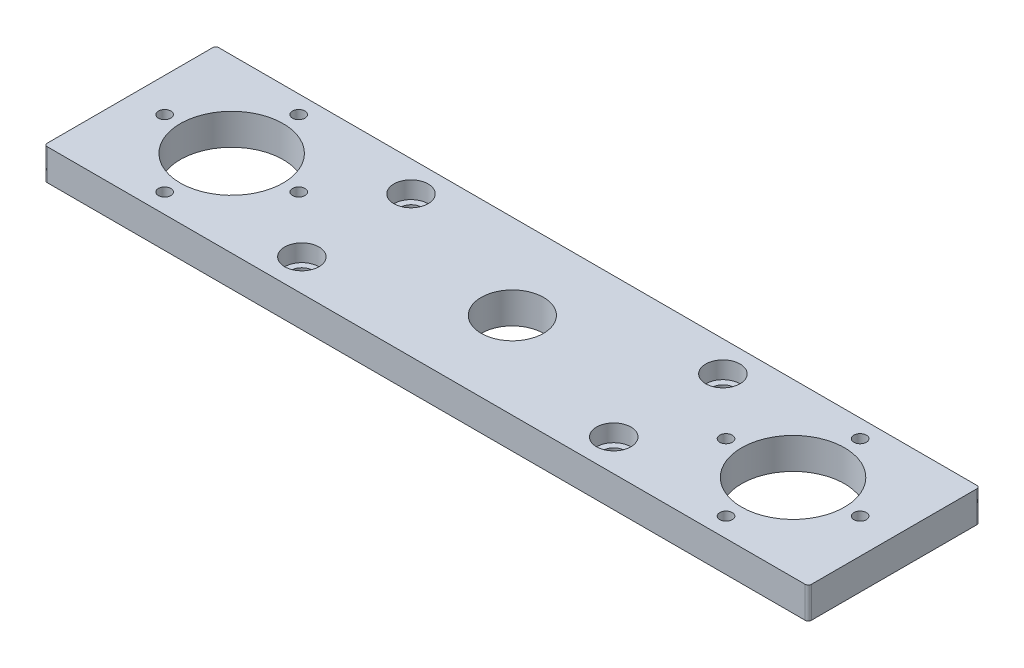
ISO-10303-21;
HEADER;
FILE_DESCRIPTION(('STEP AP214'),'2;1');
FILE_NAME('part.step','',(''),(''),'','','');
FILE_SCHEMA(('AUTOMOTIVE_DESIGN { 1 0 10303 214 1 1 1 1 }'));
ENDSEC;
DATA;
#1=APPLICATION_CONTEXT('core data for automotive mechanical design processes');
#2=APPLICATION_PROTOCOL_DEFINITION('international standard','automotive_design',2000,#1);
#3=PRODUCT_CONTEXT('',#1,'mechanical');
#4=PRODUCT('Part','Part','',(#3));
#5=PRODUCT_RELATED_PRODUCT_CATEGORY('part','',(#4));
#6=PRODUCT_DEFINITION_FORMATION('','',#4);
#7=PRODUCT_DEFINITION_CONTEXT('part definition',#1,'design');
#8=PRODUCT_DEFINITION('design','',#6,#7);
#9=PRODUCT_DEFINITION_SHAPE('','',#8);
#10=(LENGTH_UNIT() NAMED_UNIT(*) SI_UNIT(.MILLI.,.METRE.));
#11=(NAMED_UNIT(*) PLANE_ANGLE_UNIT() SI_UNIT($,.RADIAN.));
#12=(NAMED_UNIT(*) SI_UNIT($,.STERADIAN.) SOLID_ANGLE_UNIT());
#13=UNCERTAINTY_MEASURE_WITH_UNIT(LENGTH_MEASURE(1.E-05),#10,'distance_accuracy_value','');
#14=(GEOMETRIC_REPRESENTATION_CONTEXT(3) GLOBAL_UNCERTAINTY_ASSIGNED_CONTEXT((#13)) GLOBAL_UNIT_ASSIGNED_CONTEXT((#10,
#11,#12)) REPRESENTATION_CONTEXT('',''));
#15=CARTESIAN_POINT('',(0.,0.,0.));
#16=DIRECTION('',(0.,0.,1.));
#17=DIRECTION('',(1.,0.,0.));
#18=AXIS2_PLACEMENT_3D('',#15,#16,#17);
#19=CARTESIAN_POINT('',(72.5,10.,-45.));
#20=DIRECTION('',(0.,-1.,0.));
#21=DIRECTION('',(0.,0.,-1.));
#22=AXIS2_PLACEMENT_3D('',#19,#20,#21);
#23=CYLINDRICAL_SURFACE('',#22,3.50000000000001);
#24=CARTESIAN_POINT('',(72.5,0.,-45.));
#25=DIRECTION('',(0.,1.,0.));
#26=DIRECTION('',(0.,0.,1.));
#27=AXIS2_PLACEMENT_3D('',#24,#25,#26);
#28=CIRCLE('',#27,3.50000000000001);
#29=CARTESIAN_POINT('',(72.5,0.,-41.5));
#30=VERTEX_POINT('',#29);
#31=EDGE_CURVE('E605',#30,#30,#28,.F.);
#32=ORIENTED_EDGE('',*,*,#31,.T.);
#33=EDGE_LOOP('',(#32));
#34=FACE_BOUND('',#33,.T.);
#35=CARTESIAN_POINT('',(72.5,4.5,-45.));
#36=DIRECTION('',(0.,1.,0.));
#37=DIRECTION('',(0.,0.,1.));
#38=AXIS2_PLACEMENT_3D('',#35,#36,#37);
#39=CIRCLE('',#38,3.50000000000001);
#40=CARTESIAN_POINT('',(72.5,4.5,-41.5));
#41=VERTEX_POINT('',#40);
#42=EDGE_CURVE('E520',#41,#41,#39,.F.);
#43=ORIENTED_EDGE('',*,*,#42,.F.);
#44=EDGE_LOOP('',(#43));
#45=FACE_BOUND('',#44,.T.);
#46=ADVANCED_FACE('F394',(#34,#45),#23,.F.);
#47=CARTESIAN_POINT('',(72.5,10.,-10.));
#48=DIRECTION('',(0.,-1.,0.));
#49=DIRECTION('',(0.,0.,-1.));
#50=AXIS2_PLACEMENT_3D('',#47,#48,#49);
#51=CYLINDRICAL_SURFACE('',#50,3.50000000000001);
#52=CARTESIAN_POINT('',(72.5,0.,-10.));
#53=DIRECTION('',(0.,1.,0.));
#54=DIRECTION('',(0.,0.,1.));
#55=AXIS2_PLACEMENT_3D('',#52,#53,#54);
#56=CIRCLE('',#55,3.50000000000001);
#57=CARTESIAN_POINT('',(72.5,0.,-6.49999999999999));
#58=VERTEX_POINT('',#57);
#59=EDGE_CURVE('E612',#58,#58,#56,.T.);
#60=ORIENTED_EDGE('',*,*,#59,.F.);
#61=EDGE_LOOP('',(#60));
#62=FACE_BOUND('',#61,.T.);
#63=CARTESIAN_POINT('',(72.5,4.5,-10.));
#64=DIRECTION('',(0.,1.,0.));
#65=DIRECTION('',(0.,0.,1.));
#66=AXIS2_PLACEMENT_3D('',#63,#64,#65);
#67=CIRCLE('',#66,3.50000000000001);
#68=CARTESIAN_POINT('',(72.5,4.5,-6.49999999999999));
#69=VERTEX_POINT('',#68);
#70=EDGE_CURVE('E516',#69,#69,#67,.T.);
#71=ORIENTED_EDGE('',*,*,#70,.T.);
#72=EDGE_LOOP('',(#71));
#73=FACE_BOUND('',#72,.T.);
#74=ADVANCED_FACE('F782',(#62,#73),#51,.F.);
#75=CARTESIAN_POINT('',(172.5,10.,-45.));
#76=DIRECTION('',(0.,-1.,0.));
#77=DIRECTION('',(0.,0.,-1.));
#78=AXIS2_PLACEMENT_3D('',#75,#76,#77);
#79=CYLINDRICAL_SURFACE('',#78,3.49999999999999);
#80=CARTESIAN_POINT('',(172.5,0.,-45.));
#81=DIRECTION('',(0.,1.,0.));
#82=DIRECTION('',(0.,0.,1.));
#83=AXIS2_PLACEMENT_3D('',#80,#81,#82);
#84=CIRCLE('',#83,3.49999999999999);
#85=CARTESIAN_POINT('',(172.5,0.,-41.5));
#86=VERTEX_POINT('',#85);
#87=EDGE_CURVE('E616',#86,#86,#84,.T.);
#88=ORIENTED_EDGE('',*,*,#87,.F.);
#89=EDGE_LOOP('',(#88));
#90=FACE_BOUND('',#89,.T.);
#91=CARTESIAN_POINT('',(172.5,4.5,-45.));
#92=DIRECTION('',(0.,1.,0.));
#93=DIRECTION('',(0.,0.,1.));
#94=AXIS2_PLACEMENT_3D('',#91,#92,#93);
#95=CIRCLE('',#94,3.49999999999999);
#96=CARTESIAN_POINT('',(172.5,4.5,-41.5));
#97=VERTEX_POINT('',#96);
#98=EDGE_CURVE('E511',#97,#97,#95,.T.);
#99=ORIENTED_EDGE('',*,*,#98,.T.);
#100=EDGE_LOOP('',(#99));
#101=FACE_BOUND('',#100,.T.);
#102=ADVANCED_FACE('F788',(#90,#101),#79,.F.);
#103=CARTESIAN_POINT('',(172.5,10.,-10.));
#104=DIRECTION('',(0.,-1.,0.));
#105=DIRECTION('',(0.,0.,-1.));
#106=AXIS2_PLACEMENT_3D('',#103,#104,#105);
#107=CYLINDRICAL_SURFACE('',#106,3.49999999999999);
#108=CARTESIAN_POINT('',(172.5,0.,-10.));
#109=DIRECTION('',(0.,1.,0.));
#110=DIRECTION('',(0.,0.,1.));
#111=AXIS2_PLACEMENT_3D('',#108,#109,#110);
#112=CIRCLE('',#111,3.49999999999999);
#113=CARTESIAN_POINT('',(172.5,0.,-6.50000000000001));
#114=VERTEX_POINT('',#113);
#115=EDGE_CURVE('E620',#114,#114,#112,.F.);
#116=ORIENTED_EDGE('',*,*,#115,.T.);
#117=EDGE_LOOP('',(#116));
#118=FACE_BOUND('',#117,.T.);
#119=CARTESIAN_POINT('',(172.5,4.5,-10.));
#120=DIRECTION('',(0.,1.,0.));
#121=DIRECTION('',(0.,0.,1.));
#122=AXIS2_PLACEMENT_3D('',#119,#120,#121);
#123=CIRCLE('',#122,3.49999999999999);
#124=CARTESIAN_POINT('',(172.5,4.5,-6.50000000000001));
#125=VERTEX_POINT('',#124);
#126=EDGE_CURVE('E507',#125,#125,#123,.F.);
#127=ORIENTED_EDGE('',*,*,#126,.F.);
#128=EDGE_LOOP('',(#127));
#129=FACE_BOUND('',#128,.T.);
#130=ADVANCED_FACE('F733',(#118,#129),#107,.F.);
#131=CARTESIAN_POINT('',(0.,10.,0.));
#132=DIRECTION('',(0.,1.,0.));
#133=DIRECTION('',(0.,0.,1.));
#134=AXIS2_PLACEMENT_3D('',#131,#132,#133);
#135=PLANE('',#134);
#136=CARTESIAN_POINT('',(72.5,10.,-10.));
#137=DIRECTION('',(0.,1.,0.));
#138=DIRECTION('',(0.,0.,1.));
#139=AXIS2_PLACEMENT_3D('',#136,#137,#138);
#140=CIRCLE('',#139,5.5);
#141=CARTESIAN_POINT('',(72.5,10.,-4.5));
#142=VERTEX_POINT('',#141);
#143=EDGE_CURVE('E699',#142,#142,#140,.T.);
#144=ORIENTED_EDGE('',*,*,#143,.F.);
#145=EDGE_LOOP('',(#144));
#146=FACE_BOUND('',#145,.T.);
#147=CARTESIAN_POINT('',(172.5,10.,-45.));
#148=DIRECTION('',(0.,1.,0.));
#149=DIRECTION('',(0.,0.,1.));
#150=AXIS2_PLACEMENT_3D('',#147,#148,#149);
#151=CIRCLE('',#150,5.50000000000002);
#152=CARTESIAN_POINT('',(172.5,10.,-39.5));
#153=VERTEX_POINT('',#152);
#154=EDGE_CURVE('E707',#153,#153,#151,.T.);
#155=ORIENTED_EDGE('',*,*,#154,.F.);
#156=EDGE_LOOP('',(#155));
#157=FACE_BOUND('',#156,.T.);
#158=CARTESIAN_POINT('',(172.5,10.,-10.));
#159=DIRECTION('',(0.,1.,0.));
#160=DIRECTION('',(0.,0.,1.));
#161=AXIS2_PLACEMENT_3D('',#158,#159,#160);
#162=CIRCLE('',#161,5.50000000000002);
#163=CARTESIAN_POINT('',(172.5,10.,-4.49999999999998));
#164=VERTEX_POINT('',#163);
#165=EDGE_CURVE('E708',#164,#164,#162,.T.);
#166=ORIENTED_EDGE('',*,*,#165,.F.);
#167=EDGE_LOOP('',(#166));
#168=FACE_BOUND('',#167,.T.);
#169=CARTESIAN_POINT('',(72.5,10.,-45.));
#170=DIRECTION('',(0.,1.,0.));
#171=DIRECTION('',(0.,0.,1.));
#172=AXIS2_PLACEMENT_3D('',#169,#170,#171);
#173=CIRCLE('',#172,5.5);
#174=CARTESIAN_POINT('',(72.5,10.,-39.5));
#175=VERTEX_POINT('',#174);
#176=EDGE_CURVE('E695',#175,#175,#173,.T.);
#177=ORIENTED_EDGE('',*,*,#176,.F.);
#178=EDGE_LOOP('',(#177));
#179=FACE_BOUND('',#178,.T.);
#180=CARTESIAN_POINT('',(212.5,10.,-49.));
#181=DIRECTION('',(0.,1.,0.));
#182=DIRECTION('',(0.,0.,1.));
#183=AXIS2_PLACEMENT_3D('',#180,#181,#182);
#184=CIRCLE('',#183,2.);
#185=CARTESIAN_POINT('',(212.5,10.,-47.));
#186=VERTEX_POINT('',#185);
#187=EDGE_CURVE('E653',#186,#186,#184,.T.);
#188=ORIENTED_EDGE('',*,*,#187,.F.);
#189=EDGE_LOOP('',(#188));
#190=FACE_BOUND('',#189,.T.);
#191=CARTESIAN_POINT('',(32.5,10.,-6.));
#192=DIRECTION('',(0.,1.,0.));
#193=DIRECTION('',(0.,0.,1.));
#194=AXIS2_PLACEMENT_3D('',#191,#192,#193);
#195=CIRCLE('',#194,2.);
#196=CARTESIAN_POINT('',(32.5,10.,-4.));
#197=VERTEX_POINT('',#196);
#198=EDGE_CURVE('E637',#197,#197,#195,.T.);
#199=ORIENTED_EDGE('',*,*,#198,.F.);
#200=EDGE_LOOP('',(#199));
#201=FACE_BOUND('',#200,.T.);
#202=CARTESIAN_POINT('',(122.5,10.,-27.5));
#203=DIRECTION('',(0.,1.,0.));
#204=DIRECTION('',(0.,0.,1.));
#205=AXIS2_PLACEMENT_3D('',#202,#203,#204);
#206=CIRCLE('',#205,10.);
#207=CARTESIAN_POINT('',(122.5,10.,-17.5));
#208=VERTEX_POINT('',#207);
#209=EDGE_CURVE('E597',#208,#208,#206,.T.);
#210=ORIENTED_EDGE('',*,*,#209,.F.);
#211=EDGE_LOOP('',(#210));
#212=FACE_BOUND('',#211,.T.);
#213=CARTESIAN_POINT('',(212.5,10.,-27.5));
#214=DIRECTION('',(0.,1.,0.));
#215=DIRECTION('',(0.,0.,1.));
#216=AXIS2_PLACEMENT_3D('',#213,#214,#215);
#217=CIRCLE('',#216,16.5);
#218=CARTESIAN_POINT('',(212.5,10.,-11.));
#219=VERTEX_POINT('',#218);
#220=EDGE_CURVE('E499',#219,#219,#217,.F.);
#221=ORIENTED_EDGE('',*,*,#220,.T.);
#222=EDGE_LOOP('',(#221));
#223=FACE_BOUND('',#222,.T.);
#224=DIRECTION('',(1.,0.,0.));
#225=VECTOR('',#224,1.);
#226=CARTESIAN_POINT('',(0.117986059408021,10.,0.235972118816041));
#227=LINE('',#226,#225);
#228=CARTESIAN_POINT('',(1.11798605940802,10.,0.235972118816041));
#229=VERTEX_POINT('',#228);
#230=CARTESIAN_POINT('',(244.117986059408,10.,0.235972118816041));
#231=VERTEX_POINT('',#230);
#232=EDGE_CURVE('E577',#229,#231,#227,.T.);
#233=ORIENTED_EDGE('',*,*,#232,.T.);
#234=CARTESIAN_POINT('',(244.117986059408,10.,-0.764027881183959));
#235=DIRECTION('',(0.,1.,0.));
#236=DIRECTION('',(0.,0.,1.));
#237=AXIS2_PLACEMENT_3D('',#234,#235,#236);
#238=CIRCLE('',#237,1.);
#239=CARTESIAN_POINT('',(245.117986059408,10.,-0.764027881183959));
#240=VERTEX_POINT('',#239);
#241=EDGE_CURVE('E548',#231,#240,#238,.T.);
#242=ORIENTED_EDGE('',*,*,#241,.T.);
#243=DIRECTION('',(0.,0.,-1.));
#244=VECTOR('',#243,1.);
#245=CARTESIAN_POINT('',(245.117986059408,10.,0.235972118816041));
#246=LINE('',#245,#244);
#247=CARTESIAN_POINT('',(245.117986059408,10.,-53.764027881184));
#248=VERTEX_POINT('',#247);
#249=EDGE_CURVE('E482',#240,#248,#246,.T.);
#250=ORIENTED_EDGE('',*,*,#249,.T.);
#251=CARTESIAN_POINT('',(244.117986059408,10.,-53.764027881184));
#252=DIRECTION('',(0.,1.,0.));
#253=DIRECTION('',(0.,0.,1.));
#254=AXIS2_PLACEMENT_3D('',#251,#252,#253);
#255=CIRCLE('',#254,1.);
#256=CARTESIAN_POINT('',(244.117986059408,10.,-54.764027881184));
#257=VERTEX_POINT('',#256);
#258=EDGE_CURVE('E545',#248,#257,#255,.T.);
#259=ORIENTED_EDGE('',*,*,#258,.T.);
#260=DIRECTION('',(1.,0.,0.));
#261=VECTOR('',#260,1.);
#262=CARTESIAN_POINT('',(0.117986059408021,10.,-54.764027881184));
#263=LINE('',#262,#261);
#264=CARTESIAN_POINT('',(1.11798605940802,10.,-54.764027881184));
#265=VERTEX_POINT('',#264);
#266=EDGE_CURVE('E506',#265,#257,#263,.T.);
#267=ORIENTED_EDGE('',*,*,#266,.F.);
#268=CARTESIAN_POINT('',(1.11798605940802,10.,-53.764027881184));
#269=DIRECTION('',(0.,1.,0.));
#270=DIRECTION('',(0.,0.,1.));
#271=AXIS2_PLACEMENT_3D('',#268,#269,#270);
#272=CIRCLE('',#271,1.);
#273=CARTESIAN_POINT('',(0.117986059408021,10.,-53.764027881184));
#274=VERTEX_POINT('',#273);
#275=EDGE_CURVE('E410',#265,#274,#272,.T.);
#276=ORIENTED_EDGE('',*,*,#275,.T.);
#277=DIRECTION('',(0.,0.,-1.));
#278=VECTOR('',#277,1.);
#279=CARTESIAN_POINT('',(0.117986059408021,10.,0.235972118816041));
#280=LINE('',#279,#278);
#281=CARTESIAN_POINT('',(0.117986059408021,10.,-0.764027881183959));
#282=VERTEX_POINT('',#281);
#283=EDGE_CURVE('E526',#282,#274,#280,.T.);
#284=ORIENTED_EDGE('',*,*,#283,.F.);
#285=CARTESIAN_POINT('',(1.11798605940802,10.,-0.764027881183959));
#286=DIRECTION('',(0.,1.,0.));
#287=DIRECTION('',(0.,0.,1.));
#288=AXIS2_PLACEMENT_3D('',#285,#286,#287);
#289=CIRCLE('',#288,1.);
#290=EDGE_CURVE('E540',#282,#229,#289,.T.);
#291=ORIENTED_EDGE('',*,*,#290,.T.);
#292=EDGE_LOOP('',(#233,#242,#250,#259,#267,#276,#284,#291));
#293=FACE_BOUND('',#292,.T.);
#294=CARTESIAN_POINT('',(32.5,10.,-49.));
#295=DIRECTION('',(0.,1.,0.));
#296=DIRECTION('',(0.,0.,1.));
#297=AXIS2_PLACEMENT_3D('',#294,#295,#296);
#298=CIRCLE('',#297,2.00000000000001);
#299=CARTESIAN_POINT('',(32.5,10.,-47.));
#300=VERTEX_POINT('',#299);
#301=EDGE_CURVE('E624',#300,#300,#298,.F.);
#302=ORIENTED_EDGE('',*,*,#301,.T.);
#303=EDGE_LOOP('',(#302));
#304=FACE_BOUND('',#303,.T.);
#305=CARTESIAN_POINT('',(54.,10.,-27.5));
#306=DIRECTION('',(0.,1.,0.));
#307=DIRECTION('',(0.,0.,1.));
#308=AXIS2_PLACEMENT_3D('',#305,#306,#307);
#309=CIRCLE('',#308,2.);
#310=CARTESIAN_POINT('',(54.,10.,-25.5));
#311=VERTEX_POINT('',#310);
#312=EDGE_CURVE('E629',#311,#311,#309,.T.);
#313=ORIENTED_EDGE('',*,*,#312,.F.);
#314=EDGE_LOOP('',(#313));
#315=FACE_BOUND('',#314,.T.);
#316=CARTESIAN_POINT('',(11.,10.,-27.5));
#317=DIRECTION('',(0.,1.,0.));
#318=DIRECTION('',(0.,0.,1.));
#319=AXIS2_PLACEMENT_3D('',#316,#317,#318);
#320=CIRCLE('',#319,2.);
#321=CARTESIAN_POINT('',(11.,10.,-25.5));
#322=VERTEX_POINT('',#321);
#323=EDGE_CURVE('E645',#322,#322,#320,.T.);
#324=ORIENTED_EDGE('',*,*,#323,.F.);
#325=EDGE_LOOP('',(#324));
#326=FACE_BOUND('',#325,.T.);
#327=CARTESIAN_POINT('',(191.,10.,-27.5));
#328=DIRECTION('',(0.,1.,0.));
#329=DIRECTION('',(0.,0.,1.));
#330=AXIS2_PLACEMENT_3D('',#327,#328,#329);
#331=CIRCLE('',#330,2.);
#332=CARTESIAN_POINT('',(191.,10.,-25.5));
#333=VERTEX_POINT('',#332);
#334=EDGE_CURVE('E661',#333,#333,#331,.F.);
#335=ORIENTED_EDGE('',*,*,#334,.T.);
#336=EDGE_LOOP('',(#335));
#337=FACE_BOUND('',#336,.T.);
#338=CARTESIAN_POINT('',(234.,10.,-27.5));
#339=DIRECTION('',(0.,1.,0.));
#340=DIRECTION('',(0.,0.,1.));
#341=AXIS2_PLACEMENT_3D('',#338,#339,#340);
#342=CIRCLE('',#341,2.);
#343=CARTESIAN_POINT('',(234.,10.,-25.5));
#344=VERTEX_POINT('',#343);
#345=EDGE_CURVE('E669',#344,#344,#342,.F.);
#346=ORIENTED_EDGE('',*,*,#345,.T.);
#347=EDGE_LOOP('',(#346));
#348=FACE_BOUND('',#347,.T.);
#349=CARTESIAN_POINT('',(212.5,10.,-6.));
#350=DIRECTION('',(0.,1.,0.));
#351=DIRECTION('',(0.,0.,1.));
#352=AXIS2_PLACEMENT_3D('',#349,#350,#351);
#353=CIRCLE('',#352,2.);
#354=CARTESIAN_POINT('',(212.5,10.,-4.00000000000001));
#355=VERTEX_POINT('',#354);
#356=EDGE_CURVE('E677',#355,#355,#353,.F.);
#357=ORIENTED_EDGE('',*,*,#356,.T.);
#358=EDGE_LOOP('',(#357));
#359=FACE_BOUND('',#358,.T.);
#360=CARTESIAN_POINT('',(32.5,10.,-27.5));
#361=DIRECTION('',(0.,1.,0.));
#362=DIRECTION('',(0.,0.,1.));
#363=AXIS2_PLACEMENT_3D('',#360,#361,#362);
#364=CIRCLE('',#363,16.5);
#365=CARTESIAN_POINT('',(32.5,10.,-11.));
#366=VERTEX_POINT('',#365);
#367=EDGE_CURVE('E685',#366,#366,#364,.T.);
#368=ORIENTED_EDGE('',*,*,#367,.F.);
#369=EDGE_LOOP('',(#368));
#370=FACE_BOUND('',#369,.T.);
#371=ADVANCED_FACE('F730',(#146,#157,#168,#179,#190,#201,#212,#223,#293,#304,#315,#326,#337,
#348,#359,#370),#135,.T.);
#372=CARTESIAN_POINT('',(0.,0.,0.));
#373=DIRECTION('',(0.,1.,0.));
#374=DIRECTION('',(0.,0.,1.));
#375=AXIS2_PLACEMENT_3D('',#372,#373,#374);
#376=PLANE('',#375);
#377=CARTESIAN_POINT('',(212.5,0.,-6.));
#378=DIRECTION('',(0.,1.,0.));
#379=DIRECTION('',(0.,0.,1.));
#380=AXIS2_PLACEMENT_3D('',#377,#378,#379);
#381=CIRCLE('',#380,2.);
#382=CARTESIAN_POINT('',(212.5,0.,-4.00000000000001));
#383=VERTEX_POINT('',#382);
#384=EDGE_CURVE('E681',#383,#383,#381,.F.);
#385=ORIENTED_EDGE('',*,*,#384,.F.);
#386=EDGE_LOOP('',(#385));
#387=FACE_BOUND('',#386,.T.);
#388=CARTESIAN_POINT('',(234.,0.,-27.5));
#389=DIRECTION('',(0.,1.,0.));
#390=DIRECTION('',(0.,0.,1.));
#391=AXIS2_PLACEMENT_3D('',#388,#389,#390);
#392=CIRCLE('',#391,2.);
#393=CARTESIAN_POINT('',(234.,0.,-25.5));
#394=VERTEX_POINT('',#393);
#395=EDGE_CURVE('E673',#394,#394,#392,.F.);
#396=ORIENTED_EDGE('',*,*,#395,.F.);
#397=EDGE_LOOP('',(#396));
#398=FACE_BOUND('',#397,.T.);
#399=CARTESIAN_POINT('',(191.,0.,-27.5));
#400=DIRECTION('',(0.,1.,0.));
#401=DIRECTION('',(0.,0.,1.));
#402=AXIS2_PLACEMENT_3D('',#399,#400,#401);
#403=CIRCLE('',#402,2.);
#404=CARTESIAN_POINT('',(191.,0.,-25.5));
#405=VERTEX_POINT('',#404);
#406=EDGE_CURVE('E665',#405,#405,#403,.F.);
#407=ORIENTED_EDGE('',*,*,#406,.F.);
#408=EDGE_LOOP('',(#407));
#409=FACE_BOUND('',#408,.T.);
#410=CARTESIAN_POINT('',(32.5,0.,-49.));
#411=DIRECTION('',(0.,1.,0.));
#412=DIRECTION('',(0.,0.,1.));
#413=AXIS2_PLACEMENT_3D('',#410,#411,#412);
#414=CIRCLE('',#413,2.00000000000001);
#415=CARTESIAN_POINT('',(32.5,0.,-47.));
#416=VERTEX_POINT('',#415);
#417=EDGE_CURVE('E625',#416,#416,#414,.F.);
#418=ORIENTED_EDGE('',*,*,#417,.F.);
#419=EDGE_LOOP('',(#418));
#420=FACE_BOUND('',#419,.T.);
#421=ORIENTED_EDGE('',*,*,#115,.F.);
#422=EDGE_LOOP('',(#421));
#423=FACE_BOUND('',#422,.T.);
#424=ORIENTED_EDGE('',*,*,#31,.F.);
#425=EDGE_LOOP('',(#424));
#426=FACE_BOUND('',#425,.T.);
#427=CARTESIAN_POINT('',(212.5,0.,-27.5));
#428=DIRECTION('',(0.,1.,0.));
#429=DIRECTION('',(0.,0.,1.));
#430=AXIS2_PLACEMENT_3D('',#427,#428,#429);
#431=CIRCLE('',#430,16.5);
#432=CARTESIAN_POINT('',(212.5,0.,-11.));
#433=VERTEX_POINT('',#432);
#434=EDGE_CURVE('E593',#433,#433,#431,.F.);
#435=ORIENTED_EDGE('',*,*,#434,.F.);
#436=EDGE_LOOP('',(#435));
#437=FACE_BOUND('',#436,.T.);
#438=DIRECTION('',(0.,0.,-1.));
#439=VECTOR('',#438,1.);
#440=CARTESIAN_POINT('',(245.117986059408,0.,0.235972118816041));
#441=LINE('',#440,#439);
#442=CARTESIAN_POINT('',(245.117986059408,0.,-0.764027881183959));
#443=VERTEX_POINT('',#442);
#444=CARTESIAN_POINT('',(245.117986059408,0.,-53.764027881184));
#445=VERTEX_POINT('',#444);
#446=EDGE_CURVE('E479',#443,#445,#441,.T.);
#447=ORIENTED_EDGE('',*,*,#446,.F.);
#448=CARTESIAN_POINT('',(244.117986059408,0.,-0.764027881183959));
#449=DIRECTION('',(0.,1.,0.));
#450=DIRECTION('',(0.,0.,1.));
#451=AXIS2_PLACEMENT_3D('',#448,#449,#450);
#452=CIRCLE('',#451,1.);
#453=CARTESIAN_POINT('',(244.117986059408,0.,0.235972118816041));
#454=VERTEX_POINT('',#453);
#455=EDGE_CURVE('E461',#443,#454,#452,.F.);
#456=ORIENTED_EDGE('',*,*,#455,.T.);
#457=DIRECTION('',(1.,0.,0.));
#458=VECTOR('',#457,1.);
#459=CARTESIAN_POINT('',(0.117986059408021,0.,0.235972118816041));
#460=LINE('',#459,#458);
#461=CARTESIAN_POINT('',(1.11798605940802,0.,0.235972118816041));
#462=VERTEX_POINT('',#461);
#463=EDGE_CURVE('E491',#462,#454,#460,.T.);
#464=ORIENTED_EDGE('',*,*,#463,.F.);
#465=CARTESIAN_POINT('',(1.11798605940802,0.,-0.764027881183959));
#466=DIRECTION('',(0.,1.,0.));
#467=DIRECTION('',(0.,0.,1.));
#468=AXIS2_PLACEMENT_3D('',#465,#466,#467);
#469=CIRCLE('',#468,1.);
#470=CARTESIAN_POINT('',(0.117986059408021,0.,-0.764027881183959));
#471=VERTEX_POINT('',#470);
#472=EDGE_CURVE('E484',#462,#471,#469,.F.);
#473=ORIENTED_EDGE('',*,*,#472,.T.);
#474=DIRECTION('',(0.,0.,-1.));
#475=VECTOR('',#474,1.);
#476=CARTESIAN_POINT('',(0.117986059408021,0.,0.235972118816041));
#477=LINE('',#476,#475);
#478=CARTESIAN_POINT('',(0.117986059408021,0.,-53.764027881184));
#479=VERTEX_POINT('',#478);
#480=EDGE_CURVE('E497',#471,#479,#477,.T.);
#481=ORIENTED_EDGE('',*,*,#480,.T.);
#482=CARTESIAN_POINT('',(1.11798605940802,0.,-53.764027881184));
#483=DIRECTION('',(0.,1.,0.));
#484=DIRECTION('',(0.,0.,1.));
#485=AXIS2_PLACEMENT_3D('',#482,#483,#484);
#486=CIRCLE('',#485,1.);
#487=CARTESIAN_POINT('',(1.11798605940802,0.,-54.764027881184));
#488=VERTEX_POINT('',#487);
#489=EDGE_CURVE('E530',#479,#488,#486,.F.);
#490=ORIENTED_EDGE('',*,*,#489,.T.);
#491=DIRECTION('',(1.,0.,0.));
#492=VECTOR('',#491,1.);
#493=CARTESIAN_POINT('',(0.117986059408021,0.,-54.764027881184));
#494=LINE('',#493,#492);
#495=CARTESIAN_POINT('',(244.117986059408,0.,-54.764027881184));
#496=VERTEX_POINT('',#495);
#497=EDGE_CURVE('E492',#488,#496,#494,.T.);
#498=ORIENTED_EDGE('',*,*,#497,.T.);
#499=CARTESIAN_POINT('',(244.117986059408,0.,-53.764027881184));
#500=DIRECTION('',(0.,1.,0.));
#501=DIRECTION('',(0.,0.,1.));
#502=AXIS2_PLACEMENT_3D('',#499,#500,#501);
#503=CIRCLE('',#502,1.);
#504=EDGE_CURVE('E473',#496,#445,#503,.F.);
#505=ORIENTED_EDGE('',*,*,#504,.T.);
#506=EDGE_LOOP('',(#447,#456,#464,#473,#481,#490,#498,#505));
#507=FACE_BOUND('',#506,.T.);
#508=CARTESIAN_POINT('',(122.5,0.,-27.5));
#509=DIRECTION('',(0.,1.,0.));
#510=DIRECTION('',(0.,0.,1.));
#511=AXIS2_PLACEMENT_3D('',#508,#509,#510);
#512=CIRCLE('',#511,10.);
#513=CARTESIAN_POINT('',(122.5,0.,-17.5));
#514=VERTEX_POINT('',#513);
#515=EDGE_CURVE('E601',#514,#514,#512,.T.);
#516=ORIENTED_EDGE('',*,*,#515,.T.);
#517=EDGE_LOOP('',(#516));
#518=FACE_BOUND('',#517,.T.);
#519=ORIENTED_EDGE('',*,*,#59,.T.);
#520=EDGE_LOOP('',(#519));
#521=FACE_BOUND('',#520,.T.);
#522=ORIENTED_EDGE('',*,*,#87,.T.);
#523=EDGE_LOOP('',(#522));
#524=FACE_BOUND('',#523,.T.);
#525=CARTESIAN_POINT('',(54.,0.,-27.5));
#526=DIRECTION('',(0.,1.,0.));
#527=DIRECTION('',(0.,0.,1.));
#528=AXIS2_PLACEMENT_3D('',#525,#526,#527);
#529=CIRCLE('',#528,2.);
#530=CARTESIAN_POINT('',(54.,0.,-25.5));
#531=VERTEX_POINT('',#530);
#532=EDGE_CURVE('E633',#531,#531,#529,.T.);
#533=ORIENTED_EDGE('',*,*,#532,.T.);
#534=EDGE_LOOP('',(#533));
#535=FACE_BOUND('',#534,.T.);
#536=CARTESIAN_POINT('',(32.5,0.,-6.));
#537=DIRECTION('',(0.,1.,0.));
#538=DIRECTION('',(0.,0.,1.));
#539=AXIS2_PLACEMENT_3D('',#536,#537,#538);
#540=CIRCLE('',#539,2.);
#541=CARTESIAN_POINT('',(32.5,0.,-4.));
#542=VERTEX_POINT('',#541);
#543=EDGE_CURVE('E641',#542,#542,#540,.T.);
#544=ORIENTED_EDGE('',*,*,#543,.T.);
#545=EDGE_LOOP('',(#544));
#546=FACE_BOUND('',#545,.T.);
#547=CARTESIAN_POINT('',(11.,0.,-27.5));
#548=DIRECTION('',(0.,1.,0.));
#549=DIRECTION('',(0.,0.,1.));
#550=AXIS2_PLACEMENT_3D('',#547,#548,#549);
#551=CIRCLE('',#550,2.);
#552=CARTESIAN_POINT('',(11.,0.,-25.5));
#553=VERTEX_POINT('',#552);
#554=EDGE_CURVE('E649',#553,#553,#551,.T.);
#555=ORIENTED_EDGE('',*,*,#554,.T.);
#556=EDGE_LOOP('',(#555));
#557=FACE_BOUND('',#556,.T.);
#558=CARTESIAN_POINT('',(212.5,0.,-49.));
#559=DIRECTION('',(0.,1.,0.));
#560=DIRECTION('',(0.,0.,1.));
#561=AXIS2_PLACEMENT_3D('',#558,#559,#560);
#562=CIRCLE('',#561,2.);
#563=CARTESIAN_POINT('',(212.5,0.,-47.));
#564=VERTEX_POINT('',#563);
#565=EDGE_CURVE('E657',#564,#564,#562,.T.);
#566=ORIENTED_EDGE('',*,*,#565,.T.);
#567=EDGE_LOOP('',(#566));
#568=FACE_BOUND('',#567,.T.);
#569=CARTESIAN_POINT('',(32.5,0.,-27.5));
#570=DIRECTION('',(0.,1.,0.));
#571=DIRECTION('',(0.,0.,1.));
#572=AXIS2_PLACEMENT_3D('',#569,#570,#571);
#573=CIRCLE('',#572,16.5);
#574=CARTESIAN_POINT('',(32.5,0.,-11.));
#575=VERTEX_POINT('',#574);
#576=EDGE_CURVE('E524',#575,#575,#573,.T.);
#577=ORIENTED_EDGE('',*,*,#576,.T.);
#578=EDGE_LOOP('',(#577));
#579=FACE_BOUND('',#578,.T.);
#580=ADVANCED_FACE('F487',(#387,#398,#409,#420,#423,#426,#437,#507,#518,#521,#524,#535,#546,
#557,#568,#579),#376,.F.);
#581=CARTESIAN_POINT('',(0.117986059408021,10.,-54.764027881184));
#582=DIRECTION('',(0.,0.,-1.));
#583=DIRECTION('',(-1.,0.,0.));
#584=AXIS2_PLACEMENT_3D('',#581,#582,#583);
#585=PLANE('',#584);
#586=ORIENTED_EDGE('',*,*,#266,.T.);
#587=DIRECTION('',(0.,-1.,0.));
#588=VECTOR('',#587,1.);
#589=CARTESIAN_POINT('',(244.117986059408,0.,-54.764027881184));
#590=LINE('',#589,#588);
#591=EDGE_CURVE('E554',#257,#496,#590,.T.);
#592=ORIENTED_EDGE('',*,*,#591,.T.);
#593=ORIENTED_EDGE('',*,*,#497,.F.);
#594=DIRECTION('',(0.,-1.,0.));
#595=VECTOR('',#594,1.);
#596=CARTESIAN_POINT('',(1.11798605940802,10.,-54.764027881184));
#597=LINE('',#596,#595);
#598=EDGE_CURVE('E551',#488,#265,#597,.F.);
#599=ORIENTED_EDGE('',*,*,#598,.T.);
#600=EDGE_LOOP('',(#586,#592,#593,#599));
#601=FACE_BOUND('',#600,.T.);
#602=ADVANCED_FACE('F770',(#601),#585,.T.);
#603=CARTESIAN_POINT('',(0.117986059408021,10.,0.235972118816041));
#604=DIRECTION('',(-1.,0.,0.));
#605=DIRECTION('',(0.,0.,1.));
#606=AXIS2_PLACEMENT_3D('',#603,#604,#605);
#607=PLANE('',#606);
#608=ORIENTED_EDGE('',*,*,#283,.T.);
#609=DIRECTION('',(0.,-1.,0.));
#610=VECTOR('',#609,1.);
#611=CARTESIAN_POINT('',(0.117986059408021,10.,-53.764027881184));
#612=LINE('',#611,#610);
#613=EDGE_CURVE('E12',#274,#479,#612,.T.);
#614=ORIENTED_EDGE('',*,*,#613,.T.);
#615=ORIENTED_EDGE('',*,*,#480,.F.);
#616=DIRECTION('',(0.,-1.,0.));
#617=VECTOR('',#616,1.);
#618=CARTESIAN_POINT('',(0.117986059408021,10.,-0.764027881183959));
#619=LINE('',#618,#617);
#620=EDGE_CURVE('E403',#471,#282,#619,.F.);
#621=ORIENTED_EDGE('',*,*,#620,.T.);
#622=EDGE_LOOP('',(#608,#614,#615,#621));
#623=FACE_BOUND('',#622,.T.);
#624=ADVANCED_FACE('F776',(#623),#607,.T.);
#625=CARTESIAN_POINT('',(0.117986059408021,10.,0.235972118816041));
#626=DIRECTION('',(0.,0.,-1.));
#627=DIRECTION('',(-1.,0.,0.));
#628=AXIS2_PLACEMENT_3D('',#625,#626,#627);
#629=PLANE('',#628);
#630=ORIENTED_EDGE('',*,*,#463,.T.);
#631=DIRECTION('',(0.,-1.,0.));
#632=VECTOR('',#631,1.);
#633=CARTESIAN_POINT('',(244.117986059408,10.,0.235972118816041));
#634=LINE('',#633,#632);
#635=EDGE_CURVE('E466',#454,#231,#634,.F.);
#636=ORIENTED_EDGE('',*,*,#635,.T.);
#637=ORIENTED_EDGE('',*,*,#232,.F.);
#638=DIRECTION('',(0.,-1.,0.));
#639=VECTOR('',#638,1.);
#640=CARTESIAN_POINT('',(1.11798605940802,0.,0.235972118816041));
#641=LINE('',#640,#639);
#642=EDGE_CURVE('E472',#229,#462,#641,.T.);
#643=ORIENTED_EDGE('',*,*,#642,.T.);
#644=EDGE_LOOP('',(#630,#636,#637,#643));
#645=FACE_BOUND('',#644,.T.);
#646=ADVANCED_FACE('F805',(#645),#629,.F.);
#647=CARTESIAN_POINT('',(245.117986059408,10.,0.235972118816041));
#648=DIRECTION('',(-1.,0.,0.));
#649=DIRECTION('',(0.,0.,1.));
#650=AXIS2_PLACEMENT_3D('',#647,#648,#649);
#651=PLANE('',#650);
#652=ORIENTED_EDGE('',*,*,#249,.F.);
#653=DIRECTION('',(0.,-1.,0.));
#654=VECTOR('',#653,1.);
#655=CARTESIAN_POINT('',(245.117986059408,10.,-0.764027881183959));
#656=LINE('',#655,#654);
#657=EDGE_CURVE('E465',#240,#443,#656,.T.);
#658=ORIENTED_EDGE('',*,*,#657,.T.);
#659=ORIENTED_EDGE('',*,*,#446,.T.);
#660=DIRECTION('',(0.,-1.,0.));
#661=VECTOR('',#660,1.);
#662=CARTESIAN_POINT('',(245.117986059408,10.,-53.764027881184));
#663=LINE('',#662,#661);
#664=EDGE_CURVE('E485',#445,#248,#663,.F.);
#665=ORIENTED_EDGE('',*,*,#664,.T.);
#666=EDGE_LOOP('',(#652,#658,#659,#665));
#667=FACE_BOUND('',#666,.T.);
#668=ADVANCED_FACE('F478',(#667),#651,.F.);
#669=CARTESIAN_POINT('',(212.5,10.,-27.5));
#670=DIRECTION('',(0.,-1.,0.));
#671=DIRECTION('',(0.,0.,-1.));
#672=AXIS2_PLACEMENT_3D('',#669,#670,#671);
#673=CYLINDRICAL_SURFACE('',#672,16.5);
#674=ORIENTED_EDGE('',*,*,#220,.F.);
#675=EDGE_LOOP('',(#674));
#676=FACE_BOUND('',#675,.T.);
#677=ORIENTED_EDGE('',*,*,#434,.T.);
#678=EDGE_LOOP('',(#677));
#679=FACE_BOUND('',#678,.T.);
#680=ADVANCED_FACE('F798',(#676,#679),#673,.F.);
#681=CARTESIAN_POINT('',(122.5,10.,-27.5));
#682=DIRECTION('',(0.,-1.,0.));
#683=DIRECTION('',(0.,0.,-1.));
#684=AXIS2_PLACEMENT_3D('',#681,#682,#683);
#685=CYLINDRICAL_SURFACE('',#684,10.);
#686=ORIENTED_EDGE('',*,*,#209,.T.);
#687=EDGE_LOOP('',(#686));
#688=FACE_BOUND('',#687,.T.);
#689=ORIENTED_EDGE('',*,*,#515,.F.);
#690=EDGE_LOOP('',(#689));
#691=FACE_BOUND('',#690,.T.);
#692=ADVANCED_FACE('F794',(#688,#691),#685,.F.);
#693=CARTESIAN_POINT('',(32.5,10.,-49.));
#694=DIRECTION('',(0.,-1.,0.));
#695=DIRECTION('',(0.,0.,-1.));
#696=AXIS2_PLACEMENT_3D('',#693,#694,#695);
#697=CYLINDRICAL_SURFACE('',#696,2.00000000000001);
#698=ORIENTED_EDGE('',*,*,#301,.F.);
#699=EDGE_LOOP('',(#698));
#700=FACE_BOUND('',#699,.T.);
#701=ORIENTED_EDGE('',*,*,#417,.T.);
#702=EDGE_LOOP('',(#701));
#703=FACE_BOUND('',#702,.T.);
#704=ADVANCED_FACE('F797',(#700,#703),#697,.F.);
#705=CARTESIAN_POINT('',(54.,10.,-27.5));
#706=DIRECTION('',(0.,-1.,0.));
#707=DIRECTION('',(0.,0.,-1.));
#708=AXIS2_PLACEMENT_3D('',#705,#706,#707);
#709=CYLINDRICAL_SURFACE('',#708,2.);
#710=ORIENTED_EDGE('',*,*,#312,.T.);
#711=EDGE_LOOP('',(#710));
#712=FACE_BOUND('',#711,.T.);
#713=ORIENTED_EDGE('',*,*,#532,.F.);
#714=EDGE_LOOP('',(#713));
#715=FACE_BOUND('',#714,.T.);
#716=ADVANCED_FACE('F869',(#712,#715),#709,.F.);
#717=CARTESIAN_POINT('',(32.5,10.,-6.));
#718=DIRECTION('',(0.,-1.,0.));
#719=DIRECTION('',(0.,0.,-1.));
#720=AXIS2_PLACEMENT_3D('',#717,#718,#719);
#721=CYLINDRICAL_SURFACE('',#720,2.);
#722=ORIENTED_EDGE('',*,*,#198,.T.);
#723=EDGE_LOOP('',(#722));
#724=FACE_BOUND('',#723,.T.);
#725=ORIENTED_EDGE('',*,*,#543,.F.);
#726=EDGE_LOOP('',(#725));
#727=FACE_BOUND('',#726,.T.);
#728=ADVANCED_FACE('F879',(#724,#727),#721,.F.);
#729=CARTESIAN_POINT('',(11.,10.,-27.5));
#730=DIRECTION('',(0.,-1.,0.));
#731=DIRECTION('',(0.,0.,-1.));
#732=AXIS2_PLACEMENT_3D('',#729,#730,#731);
#733=CYLINDRICAL_SURFACE('',#732,2.);
#734=ORIENTED_EDGE('',*,*,#323,.T.);
#735=EDGE_LOOP('',(#734));
#736=FACE_BOUND('',#735,.T.);
#737=ORIENTED_EDGE('',*,*,#554,.F.);
#738=EDGE_LOOP('',(#737));
#739=FACE_BOUND('',#738,.T.);
#740=ADVANCED_FACE('F889',(#736,#739),#733,.F.);
#741=CARTESIAN_POINT('',(212.5,10.,-49.));
#742=DIRECTION('',(0.,-1.,0.));
#743=DIRECTION('',(0.,0.,-1.));
#744=AXIS2_PLACEMENT_3D('',#741,#742,#743);
#745=CYLINDRICAL_SURFACE('',#744,2.);
#746=ORIENTED_EDGE('',*,*,#187,.T.);
#747=EDGE_LOOP('',(#746));
#748=FACE_BOUND('',#747,.T.);
#749=ORIENTED_EDGE('',*,*,#565,.F.);
#750=EDGE_LOOP('',(#749));
#751=FACE_BOUND('',#750,.T.);
#752=ADVANCED_FACE('F899',(#748,#751),#745,.F.);
#753=CARTESIAN_POINT('',(191.,10.,-27.5));
#754=DIRECTION('',(0.,-1.,0.));
#755=DIRECTION('',(0.,0.,-1.));
#756=AXIS2_PLACEMENT_3D('',#753,#754,#755);
#757=CYLINDRICAL_SURFACE('',#756,2.);
#758=ORIENTED_EDGE('',*,*,#334,.F.);
#759=EDGE_LOOP('',(#758));
#760=FACE_BOUND('',#759,.T.);
#761=ORIENTED_EDGE('',*,*,#406,.T.);
#762=EDGE_LOOP('',(#761));
#763=FACE_BOUND('',#762,.T.);
#764=ADVANCED_FACE('F909',(#760,#763),#757,.F.);
#765=CARTESIAN_POINT('',(234.,10.,-27.5));
#766=DIRECTION('',(0.,-1.,0.));
#767=DIRECTION('',(0.,0.,-1.));
#768=AXIS2_PLACEMENT_3D('',#765,#766,#767);
#769=CYLINDRICAL_SURFACE('',#768,2.);
#770=ORIENTED_EDGE('',*,*,#345,.F.);
#771=EDGE_LOOP('',(#770));
#772=FACE_BOUND('',#771,.T.);
#773=ORIENTED_EDGE('',*,*,#395,.T.);
#774=EDGE_LOOP('',(#773));
#775=FACE_BOUND('',#774,.T.);
#776=ADVANCED_FACE('F919',(#772,#775),#769,.F.);
#777=CARTESIAN_POINT('',(212.5,10.,-6.));
#778=DIRECTION('',(0.,-1.,0.));
#779=DIRECTION('',(0.,0.,-1.));
#780=AXIS2_PLACEMENT_3D('',#777,#778,#779);
#781=CYLINDRICAL_SURFACE('',#780,2.);
#782=ORIENTED_EDGE('',*,*,#356,.F.);
#783=EDGE_LOOP('',(#782));
#784=FACE_BOUND('',#783,.T.);
#785=ORIENTED_EDGE('',*,*,#384,.T.);
#786=EDGE_LOOP('',(#785));
#787=FACE_BOUND('',#786,.T.);
#788=ADVANCED_FACE('F765',(#784,#787),#781,.F.);
#789=CARTESIAN_POINT('',(32.5,10.,-27.5));
#790=DIRECTION('',(0.,-1.,0.));
#791=DIRECTION('',(0.,0.,-1.));
#792=AXIS2_PLACEMENT_3D('',#789,#790,#791);
#793=CYLINDRICAL_SURFACE('',#792,16.5);
#794=ORIENTED_EDGE('',*,*,#367,.T.);
#795=EDGE_LOOP('',(#794));
#796=FACE_BOUND('',#795,.T.);
#797=ORIENTED_EDGE('',*,*,#576,.F.);
#798=EDGE_LOOP('',(#797));
#799=FACE_BOUND('',#798,.T.);
#800=ADVANCED_FACE('F761',(#796,#799),#793,.F.);
#801=CARTESIAN_POINT('',(172.5,4.5,-10.));
#802=DIRECTION('',(0.,1.,0.));
#803=DIRECTION('',(0.,0.,1.));
#804=AXIS2_PLACEMENT_3D('',#801,#802,#803);
#805=PLANE('',#804);
#806=CARTESIAN_POINT('',(172.5,4.5,-10.));
#807=DIRECTION('',(0.,1.,0.));
#808=DIRECTION('',(0.,0.,1.));
#809=AXIS2_PLACEMENT_3D('',#806,#807,#808);
#810=CIRCLE('',#809,5.50000000000002);
#811=CARTESIAN_POINT('',(172.5,4.5,-4.49999999999998));
#812=VERTEX_POINT('',#811);
#813=EDGE_CURVE('E719',#812,#812,#810,.T.);
#814=ORIENTED_EDGE('',*,*,#813,.T.);
#815=EDGE_LOOP('',(#814));
#816=FACE_BOUND('',#815,.T.);
#817=ORIENTED_EDGE('',*,*,#126,.T.);
#818=EDGE_LOOP('',(#817));
#819=FACE_BOUND('',#818,.T.);
#820=ADVANCED_FACE('F764',(#816,#819),#805,.T.);
#821=CARTESIAN_POINT('',(172.5,4.5,-10.));
#822=DIRECTION('',(0.,1.,0.));
#823=DIRECTION('',(0.,0.,1.));
#824=AXIS2_PLACEMENT_3D('',#821,#822,#823);
#825=CYLINDRICAL_SURFACE('',#824,5.50000000000002);
#826=ORIENTED_EDGE('',*,*,#813,.F.);
#827=EDGE_LOOP('',(#826));
#828=FACE_BOUND('',#827,.T.);
#829=ORIENTED_EDGE('',*,*,#165,.T.);
#830=EDGE_LOOP('',(#829));
#831=FACE_BOUND('',#830,.T.);
#832=ADVANCED_FACE('F728',(#828,#831),#825,.F.);
#833=CARTESIAN_POINT('',(172.5,4.5,-45.));
#834=DIRECTION('',(0.,1.,0.));
#835=DIRECTION('',(0.,0.,1.));
#836=AXIS2_PLACEMENT_3D('',#833,#834,#835);
#837=CYLINDRICAL_SURFACE('',#836,5.50000000000002);
#838=CARTESIAN_POINT('',(172.5,4.5,-45.));
#839=DIRECTION('',(0.,1.,0.));
#840=DIRECTION('',(0.,0.,1.));
#841=AXIS2_PLACEMENT_3D('',#838,#839,#840);
#842=CIRCLE('',#841,5.50000000000002);
#843=CARTESIAN_POINT('',(172.5,4.5,-39.5));
#844=VERTEX_POINT('',#843);
#845=EDGE_CURVE('E703',#844,#844,#842,.T.);
#846=ORIENTED_EDGE('',*,*,#845,.F.);
#847=EDGE_LOOP('',(#846));
#848=FACE_BOUND('',#847,.T.);
#849=ORIENTED_EDGE('',*,*,#154,.T.);
#850=EDGE_LOOP('',(#849));
#851=FACE_BOUND('',#850,.T.);
#852=ADVANCED_FACE('F986',(#848,#851),#837,.F.);
#853=CARTESIAN_POINT('',(172.5,4.5,-45.));
#854=DIRECTION('',(0.,1.,0.));
#855=DIRECTION('',(0.,0.,1.));
#856=AXIS2_PLACEMENT_3D('',#853,#854,#855);
#857=PLANE('',#856);
#858=ORIENTED_EDGE('',*,*,#98,.F.);
#859=EDGE_LOOP('',(#858));
#860=FACE_BOUND('',#859,.T.);
#861=ORIENTED_EDGE('',*,*,#845,.T.);
#862=EDGE_LOOP('',(#861));
#863=FACE_BOUND('',#862,.T.);
#864=ADVANCED_FACE('F996',(#860,#863),#857,.T.);
#865=CARTESIAN_POINT('',(72.5,4.5,-10.));
#866=DIRECTION('',(0.,1.,0.));
#867=DIRECTION('',(0.,0.,1.));
#868=AXIS2_PLACEMENT_3D('',#865,#866,#867);
#869=CYLINDRICAL_SURFACE('',#868,5.5);
#870=CARTESIAN_POINT('',(72.5,4.5,-10.));
#871=DIRECTION('',(0.,1.,0.));
#872=DIRECTION('',(0.,0.,1.));
#873=AXIS2_PLACEMENT_3D('',#870,#871,#872);
#874=CIRCLE('',#873,5.5);
#875=CARTESIAN_POINT('',(72.5,4.5,-4.5));
#876=VERTEX_POINT('',#875);
#877=EDGE_CURVE('E712',#876,#876,#874,.T.);
#878=ORIENTED_EDGE('',*,*,#877,.F.);
#879=EDGE_LOOP('',(#878));
#880=FACE_BOUND('',#879,.T.);
#881=ORIENTED_EDGE('',*,*,#143,.T.);
#882=EDGE_LOOP('',(#881));
#883=FACE_BOUND('',#882,.T.);
#884=ADVANCED_FACE('F1006',(#880,#883),#869,.F.);
#885=CARTESIAN_POINT('',(72.5,4.5,-10.));
#886=DIRECTION('',(0.,1.,0.));
#887=DIRECTION('',(0.,0.,1.));
#888=AXIS2_PLACEMENT_3D('',#885,#886,#887);
#889=PLANE('',#888);
#890=ORIENTED_EDGE('',*,*,#70,.F.);
#891=EDGE_LOOP('',(#890));
#892=FACE_BOUND('',#891,.T.);
#893=ORIENTED_EDGE('',*,*,#877,.T.);
#894=EDGE_LOOP('',(#893));
#895=FACE_BOUND('',#894,.T.);
#896=ADVANCED_FACE('F1016',(#892,#895),#889,.T.);
#897=CARTESIAN_POINT('',(72.5,4.5,-45.));
#898=DIRECTION('',(0.,1.,0.));
#899=DIRECTION('',(0.,0.,1.));
#900=AXIS2_PLACEMENT_3D('',#897,#898,#899);
#901=PLANE('',#900);
#902=CARTESIAN_POINT('',(72.5,4.5,-45.));
#903=DIRECTION('',(0.,1.,0.));
#904=DIRECTION('',(0.,0.,1.));
#905=AXIS2_PLACEMENT_3D('',#902,#903,#904);
#906=CIRCLE('',#905,5.5);
#907=CARTESIAN_POINT('',(72.5,4.5,-39.5));
#908=VERTEX_POINT('',#907);
#909=EDGE_CURVE('E512',#908,#908,#906,.T.);
#910=ORIENTED_EDGE('',*,*,#909,.T.);
#911=EDGE_LOOP('',(#910));
#912=FACE_BOUND('',#911,.T.);
#913=ORIENTED_EDGE('',*,*,#42,.T.);
#914=EDGE_LOOP('',(#913));
#915=FACE_BOUND('',#914,.T.);
#916=ADVANCED_FACE('F1026',(#912,#915),#901,.T.);
#917=CARTESIAN_POINT('',(72.5,4.5,-45.));
#918=DIRECTION('',(0.,1.,0.));
#919=DIRECTION('',(0.,0.,1.));
#920=AXIS2_PLACEMENT_3D('',#917,#918,#919);
#921=CYLINDRICAL_SURFACE('',#920,5.5);
#922=ORIENTED_EDGE('',*,*,#909,.F.);
#923=EDGE_LOOP('',(#922));
#924=FACE_BOUND('',#923,.T.);
#925=ORIENTED_EDGE('',*,*,#176,.T.);
#926=EDGE_LOOP('',(#925));
#927=FACE_BOUND('',#926,.T.);
#928=ADVANCED_FACE('F819',(#924,#927),#921,.F.);
#929=CARTESIAN_POINT('',(244.117986059408,10.,-0.764027881183959));
#930=DIRECTION('',(0.,-1.,0.));
#931=DIRECTION('',(0.,0.,-1.));
#932=AXIS2_PLACEMENT_3D('',#929,#930,#931);
#933=CYLINDRICAL_SURFACE('',#932,1.);
#934=ORIENTED_EDGE('',*,*,#241,.F.);
#935=ORIENTED_EDGE('',*,*,#635,.F.);
#936=ORIENTED_EDGE('',*,*,#455,.F.);
#937=ORIENTED_EDGE('',*,*,#657,.F.);
#938=EDGE_LOOP('',(#934,#935,#936,#937));
#939=FACE_BOUND('',#938,.T.);
#940=ADVANCED_FACE('F464',(#939),#933,.T.);
#941=CARTESIAN_POINT('',(244.117986059408,10.,-53.764027881184));
#942=DIRECTION('',(0.,1.,0.));
#943=DIRECTION('',(0.,0.,1.));
#944=AXIS2_PLACEMENT_3D('',#941,#942,#943);
#945=CYLINDRICAL_SURFACE('',#944,1.);
#946=ORIENTED_EDGE('',*,*,#258,.F.);
#947=ORIENTED_EDGE('',*,*,#664,.F.);
#948=ORIENTED_EDGE('',*,*,#504,.F.);
#949=ORIENTED_EDGE('',*,*,#591,.F.);
#950=EDGE_LOOP('',(#946,#947,#948,#949));
#951=FACE_BOUND('',#950,.T.);
#952=ADVANCED_FACE('F818',(#951),#945,.T.);
#953=CARTESIAN_POINT('',(1.11798605940802,10.,-53.764027881184));
#954=DIRECTION('',(0.,-1.,0.));
#955=DIRECTION('',(0.,0.,-1.));
#956=AXIS2_PLACEMENT_3D('',#953,#954,#955);
#957=CYLINDRICAL_SURFACE('',#956,1.);
#958=ORIENTED_EDGE('',*,*,#275,.F.);
#959=ORIENTED_EDGE('',*,*,#598,.F.);
#960=ORIENTED_EDGE('',*,*,#489,.F.);
#961=ORIENTED_EDGE('',*,*,#613,.F.);
#962=EDGE_LOOP('',(#958,#959,#960,#961));
#963=FACE_BOUND('',#962,.T.);
#964=ADVANCED_FACE('F821',(#963),#957,.T.);
#965=CARTESIAN_POINT('',(1.11798605940802,10.,-0.764027881183959));
#966=DIRECTION('',(0.,1.,0.));
#967=DIRECTION('',(0.,0.,1.));
#968=AXIS2_PLACEMENT_3D('',#965,#966,#967);
#969=CYLINDRICAL_SURFACE('',#968,1.);
#970=ORIENTED_EDGE('',*,*,#290,.F.);
#971=ORIENTED_EDGE('',*,*,#620,.F.);
#972=ORIENTED_EDGE('',*,*,#472,.F.);
#973=ORIENTED_EDGE('',*,*,#642,.F.);
#974=EDGE_LOOP('',(#970,#971,#972,#973));
#975=FACE_BOUND('',#974,.T.);
#976=ADVANCED_FACE('F396',(#975),#969,.T.);
#977=CLOSED_SHELL('',(#46,#74,#102,#130,#371,#580,#602,#624,#646,#668,#680,#692,#704,#716,#728,
#740,#752,#764,#776,#788,#800,#820,#832,#852,#864,#884,#896,#916,#928,#940,#952,#964,#976));
#978=MANIFOLD_SOLID_BREP('B2',#977);
#979=ADVANCED_BREP_SHAPE_REPRESENTATION('',(#18,#978),#14);
#980=SHAPE_DEFINITION_REPRESENTATION(#9,#979);
ENDSEC;
END-ISO-10303-21;
